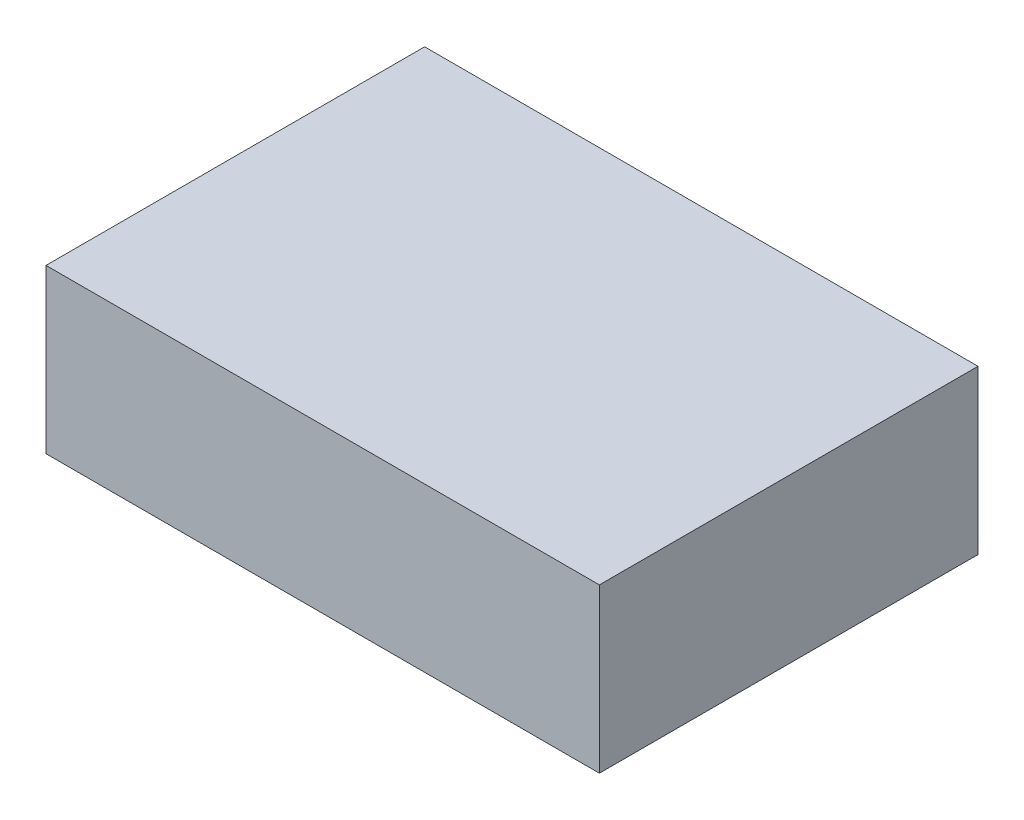
ISO-10303-21;
HEADER;
FILE_DESCRIPTION(('STEP AP214'),'2;1');
FILE_NAME('part.step','',(''),(''),'','','');
FILE_SCHEMA(('AUTOMOTIVE_DESIGN { 1 0 10303 214 1 1 1 1 }'));
ENDSEC;
DATA;
#1=APPLICATION_CONTEXT('core data for automotive mechanical design processes');
#2=APPLICATION_PROTOCOL_DEFINITION('international standard','automotive_design',2000,#1);
#3=PRODUCT_CONTEXT('',#1,'mechanical');
#4=PRODUCT('Part','Part','',(#3));
#5=PRODUCT_RELATED_PRODUCT_CATEGORY('part','',(#4));
#6=PRODUCT_DEFINITION_FORMATION('','',#4);
#7=PRODUCT_DEFINITION_CONTEXT('part definition',#1,'design');
#8=PRODUCT_DEFINITION('design','',#6,#7);
#9=PRODUCT_DEFINITION_SHAPE('','',#8);
#10=(LENGTH_UNIT() NAMED_UNIT(*) SI_UNIT(.MILLI.,.METRE.));
#11=(NAMED_UNIT(*) PLANE_ANGLE_UNIT() SI_UNIT($,.RADIAN.));
#12=(NAMED_UNIT(*) SI_UNIT($,.STERADIAN.) SOLID_ANGLE_UNIT());
#13=UNCERTAINTY_MEASURE_WITH_UNIT(LENGTH_MEASURE(1.E-05),#10,'distance_accuracy_value','');
#14=(GEOMETRIC_REPRESENTATION_CONTEXT(3) GLOBAL_UNCERTAINTY_ASSIGNED_CONTEXT((#13)) GLOBAL_UNIT_ASSIGNED_CONTEXT((#10,
#11,#12)) REPRESENTATION_CONTEXT('',''));
#15=CARTESIAN_POINT('',(0.,0.,0.));
#16=DIRECTION('',(0.,0.,1.));
#17=DIRECTION('',(1.,0.,0.));
#18=AXIS2_PLACEMENT_3D('',#15,#16,#17);
#19=CARTESIAN_POINT('',(0.,17.78,0.));
#20=DIRECTION('',(1.,0.,0.));
#21=DIRECTION('',(0.,0.,-1.));
#22=AXIS2_PLACEMENT_3D('',#19,#20,#21);
#23=PLANE('',#22);
#24=DIRECTION('',(0.,0.,1.));
#25=VECTOR('',#24,1.);
#26=CARTESIAN_POINT('',(0.,0.,0.));
#27=LINE('',#26,#25);
#28=CARTESIAN_POINT('',(0.,0.,-41.275));
#29=VERTEX_POINT('',#28);
#30=CARTESIAN_POINT('',(0.,0.,0.));
#31=VERTEX_POINT('',#30);
#32=EDGE_CURVE('E96',#29,#31,#27,.T.);
#33=ORIENTED_EDGE('',*,*,#32,.T.);
#34=DIRECTION('',(0.,-1.,0.));
#35=VECTOR('',#34,1.);
#36=CARTESIAN_POINT('',(0.,17.78,0.));
#37=LINE('',#36,#35);
#38=CARTESIAN_POINT('',(0.,17.78,0.));
#39=VERTEX_POINT('',#38);
#40=EDGE_CURVE('E11',#39,#31,#37,.T.);
#41=ORIENTED_EDGE('',*,*,#40,.F.);
#42=DIRECTION('',(0.,0.,1.));
#43=VECTOR('',#42,1.);
#44=CARTESIAN_POINT('',(0.,17.78,0.));
#45=LINE('',#44,#43);
#46=CARTESIAN_POINT('',(0.,17.78,-41.275));
#47=VERTEX_POINT('',#46);
#48=EDGE_CURVE('E84',#47,#39,#45,.T.);
#49=ORIENTED_EDGE('',*,*,#48,.F.);
#50=DIRECTION('',(0.,-1.,0.));
#51=VECTOR('',#50,1.);
#52=CARTESIAN_POINT('',(0.,17.78,-41.275));
#53=LINE('',#52,#51);
#54=EDGE_CURVE('E92',#47,#29,#53,.T.);
#55=ORIENTED_EDGE('',*,*,#54,.T.);
#56=EDGE_LOOP('',(#33,#41,#49,#55));
#57=FACE_BOUND('',#56,.T.);
#58=ADVANCED_FACE('F33',(#57),#23,.F.);
#59=CARTESIAN_POINT('',(0.,17.78,0.));
#60=DIRECTION('',(0.,0.,-1.));
#61=DIRECTION('',(-1.,0.,0.));
#62=AXIS2_PLACEMENT_3D('',#59,#60,#61);
#63=PLANE('',#62);
#64=DIRECTION('',(1.,0.,0.));
#65=VECTOR('',#64,1.);
#66=CARTESIAN_POINT('',(0.,0.,0.));
#67=LINE('',#66,#65);
#68=CARTESIAN_POINT('',(60.325,0.,0.));
#69=VERTEX_POINT('',#68);
#70=EDGE_CURVE('E88',#31,#69,#67,.T.);
#71=ORIENTED_EDGE('',*,*,#70,.T.);
#72=DIRECTION('',(0.,-1.,0.));
#73=VECTOR('',#72,1.);
#74=CARTESIAN_POINT('',(60.325,17.78,0.));
#75=LINE('',#74,#73);
#76=CARTESIAN_POINT('',(60.325,17.78,0.));
#77=VERTEX_POINT('',#76);
#78=EDGE_CURVE('E41',#77,#69,#75,.T.);
#79=ORIENTED_EDGE('',*,*,#78,.F.);
#80=DIRECTION('',(1.,0.,0.));
#81=VECTOR('',#80,1.);
#82=CARTESIAN_POINT('',(0.,17.78,0.));
#83=LINE('',#82,#81);
#84=EDGE_CURVE('E79',#39,#77,#83,.T.);
#85=ORIENTED_EDGE('',*,*,#84,.F.);
#86=ORIENTED_EDGE('',*,*,#40,.T.);
#87=EDGE_LOOP('',(#71,#79,#85,#86));
#88=FACE_BOUND('',#87,.T.);
#89=ADVANCED_FACE('F87',(#88),#63,.F.);
#90=CARTESIAN_POINT('',(60.325,17.78,0.));
#91=DIRECTION('',(-1.,0.,0.));
#92=DIRECTION('',(0.,0.,1.));
#93=AXIS2_PLACEMENT_3D('',#90,#91,#92);
#94=PLANE('',#93);
#95=DIRECTION('',(0.,0.,-1.));
#96=VECTOR('',#95,1.);
#97=CARTESIAN_POINT('',(60.325,0.,0.));
#98=LINE('',#97,#96);
#99=CARTESIAN_POINT('',(60.325,0.,-41.275));
#100=VERTEX_POINT('',#99);
#101=EDGE_CURVE('E66',#69,#100,#98,.T.);
#102=ORIENTED_EDGE('',*,*,#101,.T.);
#103=DIRECTION('',(0.,-1.,0.));
#104=VECTOR('',#103,1.);
#105=CARTESIAN_POINT('',(60.325,17.78,-41.275));
#106=LINE('',#105,#104);
#107=CARTESIAN_POINT('',(60.325,17.78,-41.275));
#108=VERTEX_POINT('',#107);
#109=EDGE_CURVE('E89',#108,#100,#106,.T.);
#110=ORIENTED_EDGE('',*,*,#109,.F.);
#111=DIRECTION('',(0.,0.,-1.));
#112=VECTOR('',#111,1.);
#113=CARTESIAN_POINT('',(60.325,17.78,0.));
#114=LINE('',#113,#112);
#115=EDGE_CURVE('E82',#77,#108,#114,.T.);
#116=ORIENTED_EDGE('',*,*,#115,.F.);
#117=ORIENTED_EDGE('',*,*,#78,.T.);
#118=EDGE_LOOP('',(#102,#110,#116,#117));
#119=FACE_BOUND('',#118,.T.);
#120=ADVANCED_FACE('F90',(#119),#94,.F.);
#121=CARTESIAN_POINT('',(0.,17.78,-41.275));
#122=DIRECTION('',(0.,0.,1.));
#123=DIRECTION('',(1.,0.,0.));
#124=AXIS2_PLACEMENT_3D('',#121,#122,#123);
#125=PLANE('',#124);
#126=DIRECTION('',(-1.,0.,0.));
#127=VECTOR('',#126,1.);
#128=CARTESIAN_POINT('',(0.,0.,-41.275));
#129=LINE('',#128,#127);
#130=EDGE_CURVE('E72',#100,#29,#129,.T.);
#131=ORIENTED_EDGE('',*,*,#130,.T.);
#132=ORIENTED_EDGE('',*,*,#54,.F.);
#133=DIRECTION('',(-1.,0.,0.));
#134=VECTOR('',#133,1.);
#135=CARTESIAN_POINT('',(0.,17.78,-41.275));
#136=LINE('',#135,#134);
#137=EDGE_CURVE('E49',#108,#47,#136,.T.);
#138=ORIENTED_EDGE('',*,*,#137,.F.);
#139=ORIENTED_EDGE('',*,*,#109,.T.);
#140=EDGE_LOOP('',(#131,#132,#138,#139));
#141=FACE_BOUND('',#140,.T.);
#142=ADVANCED_FACE('F103',(#141),#125,.F.);
#143=CARTESIAN_POINT('',(0.,17.78,0.));
#144=DIRECTION('',(0.,-1.,0.));
#145=DIRECTION('',(0.,0.,-1.));
#146=AXIS2_PLACEMENT_3D('',#143,#144,#145);
#147=PLANE('',#146);
#148=ORIENTED_EDGE('',*,*,#48,.T.);
#149=ORIENTED_EDGE('',*,*,#84,.T.);
#150=ORIENTED_EDGE('',*,*,#115,.T.);
#151=ORIENTED_EDGE('',*,*,#137,.T.);
#152=EDGE_LOOP('',(#148,#149,#150,#151));
#153=FACE_BOUND('',#152,.T.);
#154=ADVANCED_FACE('F80',(#153),#147,.F.);
#155=CARTESIAN_POINT('',(0.,0.,0.));
#156=DIRECTION('',(0.,-1.,0.));
#157=DIRECTION('',(0.,0.,-1.));
#158=AXIS2_PLACEMENT_3D('',#155,#156,#157);
#159=PLANE('',#158);
#160=ORIENTED_EDGE('',*,*,#32,.F.);
#161=ORIENTED_EDGE('',*,*,#130,.F.);
#162=ORIENTED_EDGE('',*,*,#101,.F.);
#163=ORIENTED_EDGE('',*,*,#70,.F.);
#164=EDGE_LOOP('',(#160,#161,#162,#163));
#165=FACE_BOUND('',#164,.T.);
#166=ADVANCED_FACE('F106',(#165),#159,.T.);
#167=CLOSED_SHELL('',(#58,#89,#120,#142,#154,#166));
#168=MANIFOLD_SOLID_BREP('B2',#167);
#169=ADVANCED_BREP_SHAPE_REPRESENTATION('',(#18,#168),#14);
#170=SHAPE_DEFINITION_REPRESENTATION(#9,#169);
ENDSEC;
END-ISO-10303-21;
